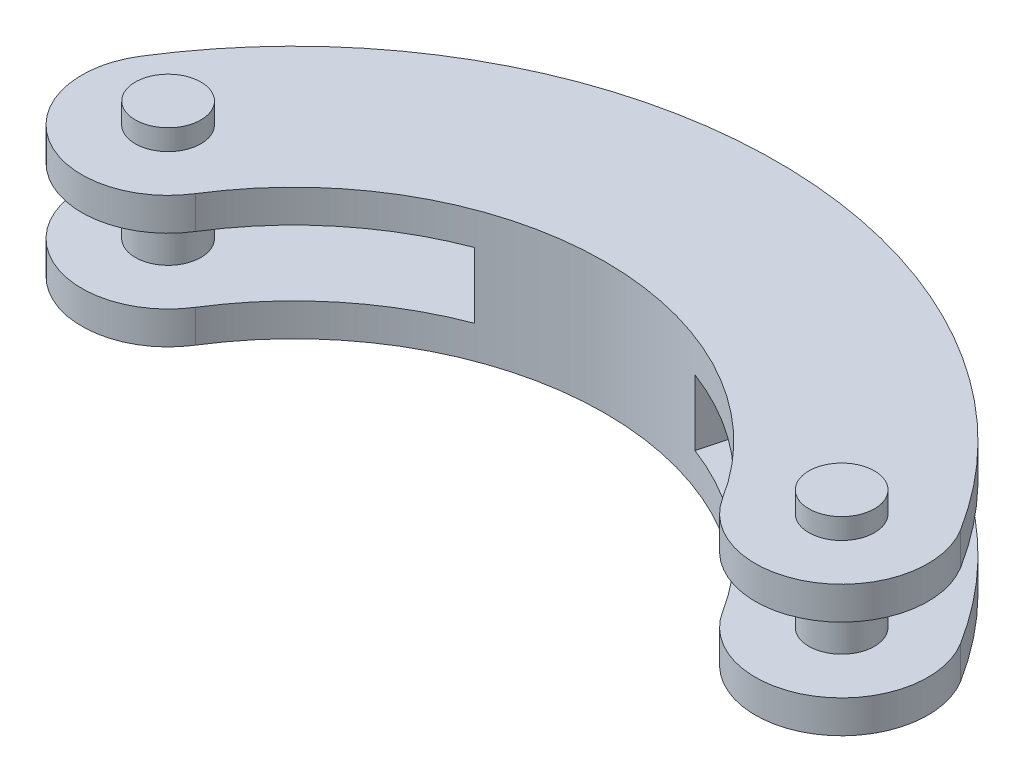
ISO-10303-21;
HEADER;
FILE_DESCRIPTION(('STEP AP214'),'2;1');
FILE_NAME('part.step','',(''),(''),'','','');
FILE_SCHEMA(('AUTOMOTIVE_DESIGN { 1 0 10303 214 1 1 1 1 }'));
ENDSEC;
DATA;
#1=APPLICATION_CONTEXT('core data for automotive mechanical design processes');
#2=APPLICATION_PROTOCOL_DEFINITION('international standard','automotive_design',2000,#1);
#3=PRODUCT_CONTEXT('',#1,'mechanical');
#4=PRODUCT('Part','Part','',(#3));
#5=PRODUCT_RELATED_PRODUCT_CATEGORY('part','',(#4));
#6=PRODUCT_DEFINITION_FORMATION('','',#4);
#7=PRODUCT_DEFINITION_CONTEXT('part definition',#1,'design');
#8=PRODUCT_DEFINITION('design','',#6,#7);
#9=PRODUCT_DEFINITION_SHAPE('','',#8);
#10=(LENGTH_UNIT() NAMED_UNIT(*) SI_UNIT(.MILLI.,.METRE.));
#11=(NAMED_UNIT(*) PLANE_ANGLE_UNIT() SI_UNIT($,.RADIAN.));
#12=(NAMED_UNIT(*) SI_UNIT($,.STERADIAN.) SOLID_ANGLE_UNIT());
#13=UNCERTAINTY_MEASURE_WITH_UNIT(LENGTH_MEASURE(1.E-05),#10,'distance_accuracy_value','');
#14=(GEOMETRIC_REPRESENTATION_CONTEXT(3) GLOBAL_UNCERTAINTY_ASSIGNED_CONTEXT((#13)) GLOBAL_UNIT_ASSIGNED_CONTEXT((#10,
#11,#12)) REPRESENTATION_CONTEXT('',''));
#15=CARTESIAN_POINT('',(0.,0.,0.));
#16=DIRECTION('',(0.,0.,1.));
#17=DIRECTION('',(1.,0.,0.));
#18=AXIS2_PLACEMENT_3D('',#15,#16,#17);
#19=CARTESIAN_POINT('',(48.75,9.5,84.5134182431431));
#20=DIRECTION('',(0.,1.,0.));
#21=DIRECTION('',(0.,0.,1.));
#22=AXIS2_PLACEMENT_3D('',#19,#20,#21);
#23=PLANE('',#22);
#24=CARTESIAN_POINT('',(-97.5,9.5,53.9543124098247));
#25=DIRECTION('',(0.,1.,0.));
#26=DIRECTION('',(0.,0.,1.));
#27=AXIS2_PLACEMENT_3D('',#24,#25,#26);
#28=CIRCLE('',#27,9.5);
#29=CARTESIAN_POINT('',(-97.5,9.5,63.4543124098247));
#30=VERTEX_POINT('',#29);
#31=EDGE_CURVE('E153',#30,#30,#28,.T.);
#32=ORIENTED_EDGE('',*,*,#31,.F.);
#33=EDGE_LOOP('',(#32));
#34=FACE_BOUND('',#33,.T.);
#35=CARTESIAN_POINT('',(0.,9.5,115.072524076462));
#36=DIRECTION('',(0.,-1.,0.));
#37=DIRECTION('',(0.,0.,1.));
#38=AXIS2_PLACEMENT_3D('',#35,#36,#37);
#39=CIRCLE('',#38,90.0725240764616);
#40=CARTESIAN_POINT('',(-76.3177063155374,9.5,67.2325063482026));
#41=VERTEX_POINT('',#40);
#42=CARTESIAN_POINT('',(-31.9266476686154,9.5,30.8481287853771));
#43=VERTEX_POINT('',#42);
#44=EDGE_CURVE('E57',#41,#43,#39,.T.);
#45=ORIENTED_EDGE('',*,*,#44,.T.);
#46=DIRECTION('',(-0.258819045102522,0.,-0.965925826289068));
#47=VECTOR('',#46,1.);
#48=CARTESIAN_POINT('',(-37.5000000000001,9.5,10.0480947161672));
#49=LINE('',#48,#47);
#50=CARTESIAN_POINT('',(-44.9097283123222,9.5,-17.6053878157005));
#51=VERTEX_POINT('',#50);
#52=EDGE_CURVE('E174',#43,#51,#49,.T.);
#53=ORIENTED_EDGE('',*,*,#52,.T.);
#54=CARTESIAN_POINT('',(0.,9.5,115.072524076462));
#55=DIRECTION('',(0.,1.,0.));
#56=DIRECTION('',(0.,0.,1.));
#57=AXIS2_PLACEMENT_3D('',#54,#55,#56);
#58=CIRCLE('',#57,140.072524076462);
#59=CARTESIAN_POINT('',(-118.682293684463,9.5,40.6761184714467));
#60=VERTEX_POINT('',#59);
#61=EDGE_CURVE('E194',#51,#60,#58,.T.);
#62=ORIENTED_EDGE('',*,*,#61,.T.);
#63=CARTESIAN_POINT('',(-97.5,9.5,53.9543124098247));
#64=DIRECTION('',(0.,1.,0.));
#65=DIRECTION('',(0.,0.,1.));
#66=AXIS2_PLACEMENT_3D('',#63,#64,#65);
#67=CIRCLE('',#66,25.);
#68=EDGE_CURVE('E198',#60,#41,#67,.T.);
#69=ORIENTED_EDGE('',*,*,#68,.T.);
#70=EDGE_LOOP('',(#45,#53,#62,#69));
#71=FACE_BOUND('',#70,.T.);
#72=ADVANCED_FACE('F34',(#34,#71),#23,.T.);
#73=CARTESIAN_POINT('',(97.5,9.5,53.9543124098247));
#74=DIRECTION('',(0.,-1.,0.));
#75=DIRECTION('',(0.,0.,-1.));
#76=AXIS2_PLACEMENT_3D('',#73,#74,#75);
#77=CYLINDRICAL_SURFACE('',#76,25.);
#78=CARTESIAN_POINT('',(97.5,0.,53.9543124098247));
#79=DIRECTION('',(0.,1.,0.));
#80=DIRECTION('',(0.,0.,1.));
#81=AXIS2_PLACEMENT_3D('',#78,#79,#80);
#82=CIRCLE('',#81,25.);
#83=CARTESIAN_POINT('',(76.3177063155374,0.,67.2325063482026));
#84=VERTEX_POINT('',#83);
#85=CARTESIAN_POINT('',(118.682293684463,0.,40.6761184714467));
#86=VERTEX_POINT('',#85);
#87=EDGE_CURVE('E190',#84,#86,#82,.T.);
#88=ORIENTED_EDGE('',*,*,#87,.T.);
#89=DIRECTION('',(0.,-1.,0.));
#90=VECTOR('',#89,1.);
#91=CARTESIAN_POINT('',(118.682293684463,9.5,40.6761184714467));
#92=LINE('',#91,#90);
#93=CARTESIAN_POINT('',(118.682293684463,9.5,40.6761184714467));
#94=VERTEX_POINT('',#93);
#95=EDGE_CURVE('E11',#94,#86,#92,.T.);
#96=ORIENTED_EDGE('',*,*,#95,.F.);
#97=CARTESIAN_POINT('',(97.5,9.5,53.9543124098247));
#98=DIRECTION('',(0.,1.,0.));
#99=DIRECTION('',(0.,0.,1.));
#100=AXIS2_PLACEMENT_3D('',#97,#98,#99);
#101=CIRCLE('',#100,25.);
#102=CARTESIAN_POINT('',(76.3177063155374,9.5,67.2325063482026));
#103=VERTEX_POINT('',#102);
#104=EDGE_CURVE('E191',#103,#94,#101,.T.);
#105=ORIENTED_EDGE('',*,*,#104,.F.);
#106=DIRECTION('',(0.,-1.,0.));
#107=VECTOR('',#106,1.);
#108=CARTESIAN_POINT('',(76.3177063155374,9.5,67.2325063482026));
#109=LINE('',#108,#107);
#110=EDGE_CURVE('E202',#103,#84,#109,.T.);
#111=ORIENTED_EDGE('',*,*,#110,.T.);
#112=EDGE_LOOP('',(#88,#96,#105,#111));
#113=FACE_BOUND('',#112,.T.);
#114=ADVANCED_FACE('F36',(#113),#77,.T.);
#115=CARTESIAN_POINT('',(0.,9.5,115.072524076462));
#116=DIRECTION('',(0.,-1.,0.));
#117=DIRECTION('',(0.,0.,-1.));
#118=AXIS2_PLACEMENT_3D('',#115,#116,#117);
#119=CYLINDRICAL_SURFACE('',#118,140.072524076462);
#120=CARTESIAN_POINT('',(0.,0.,115.072524076462));
#121=DIRECTION('',(0.,1.,0.));
#122=DIRECTION('',(0.,0.,1.));
#123=AXIS2_PLACEMENT_3D('',#120,#121,#122);
#124=CIRCLE('',#123,140.072524076462);
#125=CARTESIAN_POINT('',(-118.682293684463,0.,40.6761184714467));
#126=VERTEX_POINT('',#125);
#127=EDGE_CURVE('E205',#86,#126,#124,.T.);
#128=ORIENTED_EDGE('',*,*,#127,.T.);
#129=DIRECTION('',(0.,-1.,0.));
#130=VECTOR('',#129,1.);
#131=CARTESIAN_POINT('',(-118.682293684463,9.5,40.6761184714467));
#132=LINE('',#131,#130);
#133=EDGE_CURVE('E42',#60,#126,#132,.T.);
#134=ORIENTED_EDGE('',*,*,#133,.F.);
#135=ORIENTED_EDGE('',*,*,#61,.F.);
#136=DIRECTION('',(0.,-1.,0.));
#137=VECTOR('',#136,1.);
#138=CARTESIAN_POINT('',(-44.9097283123222,28.5,-17.6053878157005));
#139=LINE('',#138,#137);
#140=CARTESIAN_POINT('',(-44.9097283123222,28.5,-17.6053878157005));
#141=VERTEX_POINT('',#140);
#142=EDGE_CURVE('E181',#141,#51,#139,.T.);
#143=ORIENTED_EDGE('',*,*,#142,.F.);
#144=CARTESIAN_POINT('',(0.,28.5,115.072524076462));
#145=DIRECTION('',(0.,1.,0.));
#146=DIRECTION('',(0.,0.,1.));
#147=AXIS2_PLACEMENT_3D('',#144,#145,#146);
#148=CIRCLE('',#147,140.072524076462);
#149=CARTESIAN_POINT('',(-118.682293684463,28.5,40.6761184714467));
#150=VERTEX_POINT('',#149);
#151=EDGE_CURVE('E163',#141,#150,#148,.T.);
#152=ORIENTED_EDGE('',*,*,#151,.T.);
#153=DIRECTION('',(0.,-1.,0.));
#154=VECTOR('',#153,1.);
#155=CARTESIAN_POINT('',(-118.682293684463,38.,40.6761184714467));
#156=LINE('',#155,#154);
#157=CARTESIAN_POINT('',(-118.682293684463,38.,40.6761184714467));
#158=VERTEX_POINT('',#157);
#159=EDGE_CURVE('E167',#158,#150,#156,.T.);
#160=ORIENTED_EDGE('',*,*,#159,.F.);
#161=CARTESIAN_POINT('',(0.,38.,115.072524076462));
#162=DIRECTION('',(0.,1.,0.));
#163=DIRECTION('',(0.,0.,1.));
#164=AXIS2_PLACEMENT_3D('',#161,#162,#163);
#165=CIRCLE('',#164,140.072524076462);
#166=CARTESIAN_POINT('',(118.682293684463,38.,40.6761184714467));
#167=VERTEX_POINT('',#166);
#168=EDGE_CURVE('E141',#167,#158,#165,.T.);
#169=ORIENTED_EDGE('',*,*,#168,.F.);
#170=DIRECTION('',(0.,-1.,0.));
#171=VECTOR('',#170,1.);
#172=CARTESIAN_POINT('',(118.682293684463,38.,40.6761184714467));
#173=LINE('',#172,#171);
#174=CARTESIAN_POINT('',(118.682293684463,28.5,40.6761184714467));
#175=VERTEX_POINT('',#174);
#176=EDGE_CURVE('E133',#167,#175,#173,.T.);
#177=ORIENTED_EDGE('',*,*,#176,.T.);
#178=CARTESIAN_POINT('',(44.9097283123222,28.5,-17.6053878157005));
#179=VERTEX_POINT('',#178);
#180=EDGE_CURVE('E150',#175,#179,#148,.T.);
#181=ORIENTED_EDGE('',*,*,#180,.T.);
#182=DIRECTION('',(0.,-1.,0.));
#183=VECTOR('',#182,1.);
#184=CARTESIAN_POINT('',(44.9097283123222,28.5,-17.6053878157005));
#185=LINE('',#184,#183);
#186=CARTESIAN_POINT('',(44.9097283123222,9.5,-17.6053878157005));
#187=VERTEX_POINT('',#186);
#188=EDGE_CURVE('E184',#179,#187,#185,.T.);
#189=ORIENTED_EDGE('',*,*,#188,.T.);
#190=EDGE_CURVE('E196',#94,#187,#58,.T.);
#191=ORIENTED_EDGE('',*,*,#190,.F.);
#192=ORIENTED_EDGE('',*,*,#95,.T.);
#193=EDGE_LOOP('',(#128,#134,#135,#143,#152,#160,#169,#177,#181,#189,#191,#192));
#194=FACE_BOUND('',#193,.T.);
#195=ADVANCED_FACE('F239',(#194),#119,.T.);
#196=CARTESIAN_POINT('',(-97.5,9.5,53.9543124098247));
#197=DIRECTION('',(0.,-1.,0.));
#198=DIRECTION('',(0.,0.,-1.));
#199=AXIS2_PLACEMENT_3D('',#196,#197,#198);
#200=CYLINDRICAL_SURFACE('',#199,25.);
#201=CARTESIAN_POINT('',(-97.5,0.,53.9543124098247));
#202=DIRECTION('',(0.,1.,0.));
#203=DIRECTION('',(0.,0.,1.));
#204=AXIS2_PLACEMENT_3D('',#201,#202,#203);
#205=CIRCLE('',#204,25.);
#206=CARTESIAN_POINT('',(-76.3177063155374,0.,67.2325063482026));
#207=VERTEX_POINT('',#206);
#208=EDGE_CURVE('E207',#126,#207,#205,.T.);
#209=ORIENTED_EDGE('',*,*,#208,.T.);
#210=DIRECTION('',(0.,-1.,0.));
#211=VECTOR('',#210,1.);
#212=CARTESIAN_POINT('',(-76.3177063155374,9.5,67.2325063482026));
#213=LINE('',#212,#211);
#214=EDGE_CURVE('E212',#41,#207,#213,.T.);
#215=ORIENTED_EDGE('',*,*,#214,.F.);
#216=ORIENTED_EDGE('',*,*,#68,.F.);
#217=ORIENTED_EDGE('',*,*,#133,.T.);
#218=EDGE_LOOP('',(#209,#215,#216,#217));
#219=FACE_BOUND('',#218,.T.);
#220=ADVANCED_FACE('F219',(#219),#200,.T.);
#221=CARTESIAN_POINT('',(0.,9.5,115.072524076462));
#222=DIRECTION('',(0.,-1.,0.));
#223=DIRECTION('',(0.,0.,-1.));
#224=AXIS2_PLACEMENT_3D('',#221,#222,#223);
#225=CYLINDRICAL_SURFACE('',#224,90.0725240764616);
#226=CARTESIAN_POINT('',(0.,0.,115.072524076462));
#227=DIRECTION('',(0.,-1.,0.));
#228=DIRECTION('',(0.,0.,1.));
#229=AXIS2_PLACEMENT_3D('',#226,#227,#228);
#230=CIRCLE('',#229,90.0725240764616);
#231=EDGE_CURVE('E195',#207,#84,#230,.T.);
#232=ORIENTED_EDGE('',*,*,#231,.T.);
#233=ORIENTED_EDGE('',*,*,#110,.F.);
#234=CARTESIAN_POINT('',(31.9266476686154,9.5,30.8481287853771));
#235=VERTEX_POINT('',#234);
#236=EDGE_CURVE('E200',#235,#103,#39,.T.);
#237=ORIENTED_EDGE('',*,*,#236,.F.);
#238=DIRECTION('',(0.,-1.,0.));
#239=VECTOR('',#238,1.);
#240=CARTESIAN_POINT('',(31.9266476686154,28.5,30.8481287853771));
#241=LINE('',#240,#239);
#242=CARTESIAN_POINT('',(31.9266476686154,28.5,30.8481287853771));
#243=VERTEX_POINT('',#242);
#244=EDGE_CURVE('E187',#243,#235,#241,.T.);
#245=ORIENTED_EDGE('',*,*,#244,.F.);
#246=CARTESIAN_POINT('',(0.,28.5,115.072524076462));
#247=DIRECTION('',(0.,1.,0.));
#248=DIRECTION('',(0.,0.,1.));
#249=AXIS2_PLACEMENT_3D('',#246,#247,#248);
#250=CIRCLE('',#249,90.0725240764616);
#251=CARTESIAN_POINT('',(76.3177063155374,28.5,67.2325063482026));
#252=VERTEX_POINT('',#251);
#253=EDGE_CURVE('E130',#252,#243,#250,.T.);
#254=ORIENTED_EDGE('',*,*,#253,.F.);
#255=DIRECTION('',(0.,-1.,0.));
#256=VECTOR('',#255,1.);
#257=CARTESIAN_POINT('',(76.3177063155374,38.,67.2325063482026));
#258=LINE('',#257,#256);
#259=CARTESIAN_POINT('',(76.3177063155374,38.,67.2325063482026));
#260=VERTEX_POINT('',#259);
#261=EDGE_CURVE('E123',#260,#252,#258,.T.);
#262=ORIENTED_EDGE('',*,*,#261,.F.);
#263=CARTESIAN_POINT('',(0.,38.,115.072524076462));
#264=DIRECTION('',(0.,1.,0.));
#265=DIRECTION('',(0.,0.,1.));
#266=AXIS2_PLACEMENT_3D('',#263,#264,#265);
#267=CIRCLE('',#266,90.0725240764616);
#268=CARTESIAN_POINT('',(-76.3177063155374,38.,67.2325063482026));
#269=VERTEX_POINT('',#268);
#270=EDGE_CURVE('E128',#260,#269,#267,.T.);
#271=ORIENTED_EDGE('',*,*,#270,.T.);
#272=DIRECTION('',(0.,-1.,0.));
#273=VECTOR('',#272,1.);
#274=CARTESIAN_POINT('',(-76.3177063155374,38.,67.2325063482026));
#275=LINE('',#274,#273);
#276=CARTESIAN_POINT('',(-76.3177063155374,28.5,67.2325063482026));
#277=VERTEX_POINT('',#276);
#278=EDGE_CURVE('E158',#269,#277,#275,.T.);
#279=ORIENTED_EDGE('',*,*,#278,.T.);
#280=CARTESIAN_POINT('',(-31.9266476686154,28.5,30.8481287853771));
#281=VERTEX_POINT('',#280);
#282=EDGE_CURVE('E161',#281,#277,#250,.T.);
#283=ORIENTED_EDGE('',*,*,#282,.F.);
#284=DIRECTION('',(0.,-1.,0.));
#285=VECTOR('',#284,1.);
#286=CARTESIAN_POINT('',(-31.9266476686154,28.5,30.8481287853771));
#287=LINE('',#286,#285);
#288=EDGE_CURVE('E177',#281,#43,#287,.T.);
#289=ORIENTED_EDGE('',*,*,#288,.T.);
#290=ORIENTED_EDGE('',*,*,#44,.F.);
#291=ORIENTED_EDGE('',*,*,#214,.T.);
#292=EDGE_LOOP('',(#232,#233,#237,#245,#254,#262,#271,#279,#283,#289,#290,#291));
#293=FACE_BOUND('',#292,.T.);
#294=ADVANCED_FACE('F125',(#293),#225,.F.);
#295=CARTESIAN_POINT('',(97.5,9.5,53.9543124098247));
#296=DIRECTION('',(0.,1.,0.));
#297=DIRECTION('',(0.,0.,1.));
#298=AXIS2_PLACEMENT_3D('',#295,#296,#297);
#299=CIRCLE('',#298,9.5);
#300=CARTESIAN_POINT('',(97.5,9.5,63.4543124098247));
#301=VERTEX_POINT('',#300);
#302=EDGE_CURVE('E270',#301,#301,#299,.T.);
#303=ORIENTED_EDGE('',*,*,#302,.F.);
#304=EDGE_LOOP('',(#303));
#305=FACE_BOUND('',#304,.T.);
#306=DIRECTION('',(0.258819045102522,0.,-0.965925826289068));
#307=VECTOR('',#306,1.);
#308=CARTESIAN_POINT('',(37.5000000000001,9.5,10.0480947161672));
#309=LINE('',#308,#307);
#310=EDGE_CURVE('E49',#235,#187,#309,.T.);
#311=ORIENTED_EDGE('',*,*,#310,.F.);
#312=ORIENTED_EDGE('',*,*,#236,.T.);
#313=ORIENTED_EDGE('',*,*,#104,.T.);
#314=ORIENTED_EDGE('',*,*,#190,.T.);
#315=EDGE_LOOP('',(#311,#312,#313,#314));
#316=FACE_BOUND('',#315,.T.);
#317=ADVANCED_FACE('F231',(#305,#316),#23,.T.);
#318=CARTESIAN_POINT('',(48.75,0.,84.5134182431431));
#319=DIRECTION('',(0.,1.,0.));
#320=DIRECTION('',(0.,0.,1.));
#321=AXIS2_PLACEMENT_3D('',#318,#319,#320);
#322=PLANE('',#321);
#323=CARTESIAN_POINT('',(97.5,0.,53.9543124098247));
#324=DIRECTION('',(0.,1.,0.));
#325=DIRECTION('',(0.,0.,1.));
#326=AXIS2_PLACEMENT_3D('',#323,#324,#325);
#327=CIRCLE('',#326,9.5);
#328=CARTESIAN_POINT('',(97.5,0.,63.4543124098247));
#329=VERTEX_POINT('',#328);
#330=EDGE_CURVE('E289',#329,#329,#327,.T.);
#331=ORIENTED_EDGE('',*,*,#330,.T.);
#332=EDGE_LOOP('',(#331));
#333=FACE_BOUND('',#332,.T.);
#334=CARTESIAN_POINT('',(-97.5,0.,53.9543124098247));
#335=DIRECTION('',(0.,1.,0.));
#336=DIRECTION('',(0.,0.,1.));
#337=AXIS2_PLACEMENT_3D('',#334,#335,#336);
#338=CIRCLE('',#337,9.5);
#339=CARTESIAN_POINT('',(-97.5,0.,63.4543124098247));
#340=VERTEX_POINT('',#339);
#341=EDGE_CURVE('E277',#340,#340,#338,.T.);
#342=ORIENTED_EDGE('',*,*,#341,.T.);
#343=EDGE_LOOP('',(#342));
#344=FACE_BOUND('',#343,.T.);
#345=ORIENTED_EDGE('',*,*,#87,.F.);
#346=ORIENTED_EDGE('',*,*,#231,.F.);
#347=ORIENTED_EDGE('',*,*,#208,.F.);
#348=ORIENTED_EDGE('',*,*,#127,.F.);
#349=EDGE_LOOP('',(#345,#346,#347,#348));
#350=FACE_BOUND('',#349,.T.);
#351=ADVANCED_FACE('F226',(#333,#344,#350),#322,.F.);
#352=CARTESIAN_POINT('',(37.5000000000001,28.5,10.0480947161672));
#353=DIRECTION('',(-0.965925826289068,0.,-0.258819045102522));
#354=DIRECTION('',(-0.258819045102522,0.,0.965925826289068));
#355=AXIS2_PLACEMENT_3D('',#352,#353,#354);
#356=PLANE('',#355);
#357=ORIENTED_EDGE('',*,*,#310,.T.);
#358=ORIENTED_EDGE('',*,*,#188,.F.);
#359=DIRECTION('',(0.258819045102522,0.,-0.965925826289068));
#360=VECTOR('',#359,1.);
#361=CARTESIAN_POINT('',(37.5000000000001,28.5,10.0480947161672));
#362=LINE('',#361,#360);
#363=EDGE_CURVE('E171',#243,#179,#362,.T.);
#364=ORIENTED_EDGE('',*,*,#363,.F.);
#365=ORIENTED_EDGE('',*,*,#244,.T.);
#366=EDGE_LOOP('',(#357,#358,#364,#365));
#367=FACE_BOUND('',#366,.T.);
#368=ADVANCED_FACE('F234',(#367),#356,.F.);
#369=CARTESIAN_POINT('',(-37.5000000000001,28.5,10.0480947161672));
#370=DIRECTION('',(-0.965925826289068,0.,0.258819045102522));
#371=DIRECTION('',(0.258819045102522,0.,0.965925826289068));
#372=AXIS2_PLACEMENT_3D('',#369,#370,#371);
#373=PLANE('',#372);
#374=ORIENTED_EDGE('',*,*,#52,.F.);
#375=ORIENTED_EDGE('',*,*,#288,.F.);
#376=DIRECTION('',(-0.258819045102522,0.,-0.965925826289068));
#377=VECTOR('',#376,1.);
#378=CARTESIAN_POINT('',(-37.5000000000001,28.5,10.0480947161672));
#379=LINE('',#378,#377);
#380=EDGE_CURVE('E173',#281,#141,#379,.T.);
#381=ORIENTED_EDGE('',*,*,#380,.T.);
#382=ORIENTED_EDGE('',*,*,#142,.T.);
#383=EDGE_LOOP('',(#374,#375,#381,#382));
#384=FACE_BOUND('',#383,.T.);
#385=ADVANCED_FACE('F250',(#384),#373,.T.);
#386=CARTESIAN_POINT('',(0.,28.5,0.));
#387=DIRECTION('',(0.,1.,0.));
#388=DIRECTION('',(0.,0.,1.));
#389=AXIS2_PLACEMENT_3D('',#386,#387,#388);
#390=PLANE('',#389);
#391=CARTESIAN_POINT('',(97.5,28.5,53.9543124098247));
#392=DIRECTION('',(0.,1.,0.));
#393=DIRECTION('',(0.,0.,1.));
#394=AXIS2_PLACEMENT_3D('',#391,#392,#393);
#395=CIRCLE('',#394,9.5);
#396=CARTESIAN_POINT('',(97.5,28.5,63.4543124098247));
#397=VERTEX_POINT('',#396);
#398=EDGE_CURVE('E294',#397,#397,#395,.T.);
#399=ORIENTED_EDGE('',*,*,#398,.T.);
#400=EDGE_LOOP('',(#399));
#401=FACE_BOUND('',#400,.T.);
#402=ORIENTED_EDGE('',*,*,#253,.T.);
#403=ORIENTED_EDGE('',*,*,#363,.T.);
#404=ORIENTED_EDGE('',*,*,#180,.F.);
#405=CARTESIAN_POINT('',(97.5,28.5,53.9543124098247));
#406=DIRECTION('',(0.,1.,0.));
#407=DIRECTION('',(0.,0.,1.));
#408=AXIS2_PLACEMENT_3D('',#405,#406,#407);
#409=CIRCLE('',#408,25.);
#410=EDGE_CURVE('E160',#252,#175,#409,.T.);
#411=ORIENTED_EDGE('',*,*,#410,.F.);
#412=EDGE_LOOP('',(#402,#403,#404,#411));
#413=FACE_BOUND('',#412,.T.);
#414=ADVANCED_FACE('F238',(#401,#413),#390,.F.);
#415=CARTESIAN_POINT('',(97.5,38.,53.9543124098247));
#416=DIRECTION('',(0.,-1.,0.));
#417=DIRECTION('',(0.,0.,-1.));
#418=AXIS2_PLACEMENT_3D('',#415,#416,#417);
#419=CYLINDRICAL_SURFACE('',#418,25.);
#420=ORIENTED_EDGE('',*,*,#410,.T.);
#421=ORIENTED_EDGE('',*,*,#176,.F.);
#422=CARTESIAN_POINT('',(97.5,38.,53.9543124098247));
#423=DIRECTION('',(0.,1.,0.));
#424=DIRECTION('',(0.,0.,1.));
#425=AXIS2_PLACEMENT_3D('',#422,#423,#424);
#426=CIRCLE('',#425,25.);
#427=EDGE_CURVE('E136',#260,#167,#426,.T.);
#428=ORIENTED_EDGE('',*,*,#427,.F.);
#429=ORIENTED_EDGE('',*,*,#261,.T.);
#430=EDGE_LOOP('',(#420,#421,#428,#429));
#431=FACE_BOUND('',#430,.T.);
#432=ADVANCED_FACE('F137',(#431),#419,.T.);
#433=CARTESIAN_POINT('',(-97.5,38.,53.9543124098247));
#434=DIRECTION('',(0.,-1.,0.));
#435=DIRECTION('',(0.,0.,-1.));
#436=AXIS2_PLACEMENT_3D('',#433,#434,#435);
#437=CYLINDRICAL_SURFACE('',#436,25.);
#438=CARTESIAN_POINT('',(-97.5,28.5,53.9543124098247));
#439=DIRECTION('',(0.,1.,0.));
#440=DIRECTION('',(0.,0.,1.));
#441=AXIS2_PLACEMENT_3D('',#438,#439,#440);
#442=CIRCLE('',#441,25.);
#443=EDGE_CURVE('E147',#150,#277,#442,.T.);
#444=ORIENTED_EDGE('',*,*,#443,.T.);
#445=ORIENTED_EDGE('',*,*,#278,.F.);
#446=CARTESIAN_POINT('',(-97.5,38.,53.9543124098247));
#447=DIRECTION('',(0.,1.,0.));
#448=DIRECTION('',(0.,0.,1.));
#449=AXIS2_PLACEMENT_3D('',#446,#447,#448);
#450=CIRCLE('',#449,25.);
#451=EDGE_CURVE('E145',#158,#269,#450,.T.);
#452=ORIENTED_EDGE('',*,*,#451,.F.);
#453=ORIENTED_EDGE('',*,*,#159,.T.);
#454=EDGE_LOOP('',(#444,#445,#452,#453));
#455=FACE_BOUND('',#454,.T.);
#456=ADVANCED_FACE('F244',(#455),#437,.T.);
#457=CARTESIAN_POINT('',(0.,38.,0.));
#458=DIRECTION('',(0.,1.,0.));
#459=DIRECTION('',(0.,0.,1.));
#460=AXIS2_PLACEMENT_3D('',#457,#458,#459);
#461=PLANE('',#460);
#462=CARTESIAN_POINT('',(97.5,38.,53.9543124098247));
#463=DIRECTION('',(0.,1.,0.));
#464=DIRECTION('',(0.,0.,1.));
#465=AXIS2_PLACEMENT_3D('',#462,#463,#464);
#466=CIRCLE('',#465,9.5);
#467=CARTESIAN_POINT('',(97.5,38.,63.4543124098247));
#468=VERTEX_POINT('',#467);
#469=EDGE_CURVE('E273',#468,#468,#466,.T.);
#470=ORIENTED_EDGE('',*,*,#469,.F.);
#471=EDGE_LOOP('',(#470));
#472=FACE_BOUND('',#471,.T.);
#473=CARTESIAN_POINT('',(-97.5,38.,53.9543124098247));
#474=DIRECTION('',(0.,1.,0.));
#475=DIRECTION('',(0.,0.,1.));
#476=AXIS2_PLACEMENT_3D('',#473,#474,#475);
#477=CIRCLE('',#476,9.5);
#478=CARTESIAN_POINT('',(-97.5,38.,63.4543124098247));
#479=VERTEX_POINT('',#478);
#480=EDGE_CURVE('E272',#479,#479,#477,.T.);
#481=ORIENTED_EDGE('',*,*,#480,.F.);
#482=EDGE_LOOP('',(#481));
#483=FACE_BOUND('',#482,.T.);
#484=ORIENTED_EDGE('',*,*,#270,.F.);
#485=ORIENTED_EDGE('',*,*,#427,.T.);
#486=ORIENTED_EDGE('',*,*,#168,.T.);
#487=ORIENTED_EDGE('',*,*,#451,.T.);
#488=EDGE_LOOP('',(#484,#485,#486,#487));
#489=FACE_BOUND('',#488,.T.);
#490=ADVANCED_FACE('F143',(#472,#483,#489),#461,.T.);
#491=CARTESIAN_POINT('',(-97.5,28.5,53.9543124098247));
#492=DIRECTION('',(0.,1.,0.));
#493=DIRECTION('',(0.,0.,1.));
#494=AXIS2_PLACEMENT_3D('',#491,#492,#493);
#495=CIRCLE('',#494,9.5);
#496=CARTESIAN_POINT('',(-97.5,28.5,63.4543124098247));
#497=VERTEX_POINT('',#496);
#498=EDGE_CURVE('E282',#497,#497,#495,.T.);
#499=ORIENTED_EDGE('',*,*,#498,.T.);
#500=EDGE_LOOP('',(#499));
#501=FACE_BOUND('',#500,.T.);
#502=ORIENTED_EDGE('',*,*,#380,.F.);
#503=ORIENTED_EDGE('',*,*,#282,.T.);
#504=ORIENTED_EDGE('',*,*,#443,.F.);
#505=ORIENTED_EDGE('',*,*,#151,.F.);
#506=EDGE_LOOP('',(#502,#503,#504,#505));
#507=FACE_BOUND('',#506,.T.);
#508=ADVANCED_FACE('F339',(#501,#507),#390,.F.);
#509=CARTESIAN_POINT('',(-97.5,-6.00000000000001,53.9543124098247));
#510=DIRECTION('',(0.,1.,0.));
#511=DIRECTION('',(0.,0.,1.));
#512=AXIS2_PLACEMENT_3D('',#509,#510,#511);
#513=CYLINDRICAL_SURFACE('',#512,9.5);
#514=ORIENTED_EDGE('',*,*,#31,.T.);
#515=EDGE_LOOP('',(#514));
#516=FACE_BOUND('',#515,.T.);
#517=ORIENTED_EDGE('',*,*,#498,.F.);
#518=EDGE_LOOP('',(#517));
#519=FACE_BOUND('',#518,.T.);
#520=ADVANCED_FACE('F332',(#516,#519),#513,.T.);
#521=CARTESIAN_POINT('',(-97.5,44.,53.9543124098247));
#522=DIRECTION('',(0.,1.,0.));
#523=DIRECTION('',(0.,0.,1.));
#524=AXIS2_PLACEMENT_3D('',#521,#522,#523);
#525=PLANE('',#524);
#526=CARTESIAN_POINT('',(-97.5,44.,53.9543124098247));
#527=DIRECTION('',(0.,1.,0.));
#528=DIRECTION('',(0.,0.,1.));
#529=AXIS2_PLACEMENT_3D('',#526,#527,#528);
#530=CIRCLE('',#529,9.5);
#531=CARTESIAN_POINT('',(-97.5,44.,63.4543124098247));
#532=VERTEX_POINT('',#531);
#533=EDGE_CURVE('E286',#532,#532,#530,.T.);
#534=ORIENTED_EDGE('',*,*,#533,.T.);
#535=EDGE_LOOP('',(#534));
#536=FACE_BOUND('',#535,.T.);
#537=ADVANCED_FACE('F328',(#536),#525,.T.);
#538=ORIENTED_EDGE('',*,*,#480,.T.);
#539=EDGE_LOOP('',(#538));
#540=FACE_BOUND('',#539,.T.);
#541=ORIENTED_EDGE('',*,*,#533,.F.);
#542=EDGE_LOOP('',(#541));
#543=FACE_BOUND('',#542,.T.);
#544=ADVANCED_FACE('F331',(#540,#543),#513,.T.);
#545=CARTESIAN_POINT('',(-97.5,-6.00000000000001,53.9543124098247));
#546=DIRECTION('',(0.,1.,0.));
#547=DIRECTION('',(0.,0.,1.));
#548=AXIS2_PLACEMENT_3D('',#545,#546,#547);
#549=CIRCLE('',#548,9.5);
#550=CARTESIAN_POINT('',(-97.5,-6.00000000000001,63.4543124098247));
#551=VERTEX_POINT('',#550);
#552=EDGE_CURVE('E285',#551,#551,#549,.T.);
#553=ORIENTED_EDGE('',*,*,#552,.T.);
#554=EDGE_LOOP('',(#553));
#555=FACE_BOUND('',#554,.T.);
#556=ORIENTED_EDGE('',*,*,#341,.F.);
#557=EDGE_LOOP('',(#556));
#558=FACE_BOUND('',#557,.T.);
#559=ADVANCED_FACE('F326',(#555,#558),#513,.T.);
#560=CARTESIAN_POINT('',(-97.5,-6.00000000000001,53.9543124098247));
#561=DIRECTION('',(0.,1.,0.));
#562=DIRECTION('',(0.,0.,1.));
#563=AXIS2_PLACEMENT_3D('',#560,#561,#562);
#564=PLANE('',#563);
#565=ORIENTED_EDGE('',*,*,#552,.F.);
#566=EDGE_LOOP('',(#565));
#567=FACE_BOUND('',#566,.T.);
#568=ADVANCED_FACE('F319',(#567),#564,.F.);
#569=CARTESIAN_POINT('',(97.5,44.,53.9543124098247));
#570=DIRECTION('',(0.,1.,0.));
#571=DIRECTION('',(0.,0.,1.));
#572=AXIS2_PLACEMENT_3D('',#569,#570,#571);
#573=PLANE('',#572);
#574=CARTESIAN_POINT('',(97.5,44.,53.9543124098247));
#575=DIRECTION('',(0.,1.,0.));
#576=DIRECTION('',(0.,0.,1.));
#577=AXIS2_PLACEMENT_3D('',#574,#575,#576);
#578=CIRCLE('',#577,9.5);
#579=CARTESIAN_POINT('',(97.5,44.,63.4543124098247));
#580=VERTEX_POINT('',#579);
#581=EDGE_CURVE('E298',#580,#580,#578,.T.);
#582=ORIENTED_EDGE('',*,*,#581,.T.);
#583=EDGE_LOOP('',(#582));
#584=FACE_BOUND('',#583,.T.);
#585=ADVANCED_FACE('F317',(#584),#573,.T.);
#586=CARTESIAN_POINT('',(97.5,-6.00000000000001,53.9543124098247));
#587=DIRECTION('',(0.,1.,0.));
#588=DIRECTION('',(0.,0.,1.));
#589=AXIS2_PLACEMENT_3D('',#586,#587,#588);
#590=CYLINDRICAL_SURFACE('',#589,9.5);
#591=ORIENTED_EDGE('',*,*,#469,.T.);
#592=EDGE_LOOP('',(#591));
#593=FACE_BOUND('',#592,.T.);
#594=ORIENTED_EDGE('',*,*,#581,.F.);
#595=EDGE_LOOP('',(#594));
#596=FACE_BOUND('',#595,.T.);
#597=ADVANCED_FACE('F315',(#593,#596),#590,.T.);
#598=ORIENTED_EDGE('',*,*,#302,.T.);
#599=EDGE_LOOP('',(#598));
#600=FACE_BOUND('',#599,.T.);
#601=ORIENTED_EDGE('',*,*,#398,.F.);
#602=EDGE_LOOP('',(#601));
#603=FACE_BOUND('',#602,.T.);
#604=ADVANCED_FACE('F313',(#600,#603),#590,.T.);
#605=CARTESIAN_POINT('',(97.5,-6.00000000000001,53.9543124098247));
#606=DIRECTION('',(0.,1.,0.));
#607=DIRECTION('',(0.,0.,1.));
#608=AXIS2_PLACEMENT_3D('',#605,#606,#607);
#609=CIRCLE('',#608,9.5);
#610=CARTESIAN_POINT('',(97.5,-6.00000000000001,63.4543124098247));
#611=VERTEX_POINT('',#610);
#612=EDGE_CURVE('E297',#611,#611,#609,.T.);
#613=ORIENTED_EDGE('',*,*,#612,.T.);
#614=EDGE_LOOP('',(#613));
#615=FACE_BOUND('',#614,.T.);
#616=ORIENTED_EDGE('',*,*,#330,.F.);
#617=EDGE_LOOP('',(#616));
#618=FACE_BOUND('',#617,.T.);
#619=ADVANCED_FACE('F304',(#615,#618),#590,.T.);
#620=CARTESIAN_POINT('',(97.5,-6.00000000000001,53.9543124098247));
#621=DIRECTION('',(0.,1.,0.));
#622=DIRECTION('',(0.,0.,1.));
#623=AXIS2_PLACEMENT_3D('',#620,#621,#622);
#624=PLANE('',#623);
#625=ORIENTED_EDGE('',*,*,#612,.F.);
#626=EDGE_LOOP('',(#625));
#627=FACE_BOUND('',#626,.T.);
#628=ADVANCED_FACE('F307',(#627),#624,.F.);
#629=CLOSED_SHELL('',(#72,#114,#195,#220,#294,#317,#351,#368,#385,#414,#432,#456,#490,#508,#520,
#537,#544,#559,#568,#585,#597,#604,#619,#628));
#630=MANIFOLD_SOLID_BREP('B2',#629);
#631=ADVANCED_BREP_SHAPE_REPRESENTATION('',(#18,#630),#14);
#632=SHAPE_DEFINITION_REPRESENTATION(#9,#631);
ENDSEC;
END-ISO-10303-21;
